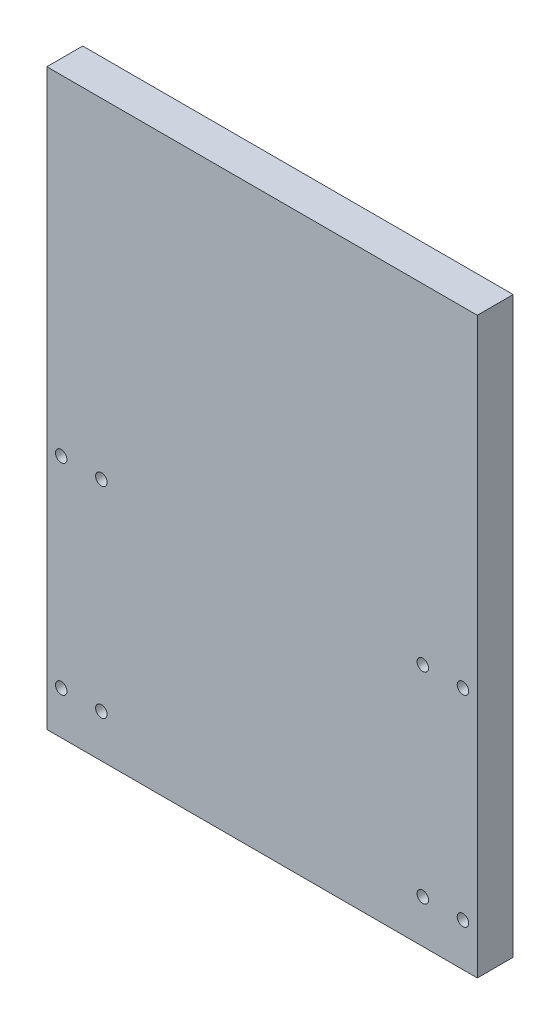
ISO-10303-21;
HEADER;
FILE_DESCRIPTION(('STEP AP214'),'2;1');
FILE_NAME('part.step','',(''),(''),'','','');
FILE_SCHEMA(('AUTOMOTIVE_DESIGN { 1 0 10303 214 1 1 1 1 }'));
ENDSEC;
DATA;
#1=APPLICATION_CONTEXT('core data for automotive mechanical design processes');
#2=APPLICATION_PROTOCOL_DEFINITION('international standard','automotive_design',2000,#1);
#3=PRODUCT_CONTEXT('',#1,'mechanical');
#4=PRODUCT('Part','Part','',(#3));
#5=PRODUCT_RELATED_PRODUCT_CATEGORY('part','',(#4));
#6=PRODUCT_DEFINITION_FORMATION('','',#4);
#7=PRODUCT_DEFINITION_CONTEXT('part definition',#1,'design');
#8=PRODUCT_DEFINITION('design','',#6,#7);
#9=PRODUCT_DEFINITION_SHAPE('','',#8);
#10=(LENGTH_UNIT() NAMED_UNIT(*) SI_UNIT(.MILLI.,.METRE.));
#11=(NAMED_UNIT(*) PLANE_ANGLE_UNIT() SI_UNIT($,.RADIAN.));
#12=(NAMED_UNIT(*) SI_UNIT($,.STERADIAN.) SOLID_ANGLE_UNIT());
#13=UNCERTAINTY_MEASURE_WITH_UNIT(LENGTH_MEASURE(1.E-05),#10,'distance_accuracy_value','');
#14=(GEOMETRIC_REPRESENTATION_CONTEXT(3) GLOBAL_UNCERTAINTY_ASSIGNED_CONTEXT((#13)) GLOBAL_UNIT_ASSIGNED_CONTEXT((#10,
#11,#12)) REPRESENTATION_CONTEXT('',''));
#15=CARTESIAN_POINT('',(0.,0.,0.));
#16=DIRECTION('',(0.,0.,1.));
#17=DIRECTION('',(1.,0.,0.));
#18=AXIS2_PLACEMENT_3D('',#15,#16,#17);
#19=CARTESIAN_POINT('',(150.,200.,-25.));
#20=DIRECTION('',(1.,0.,0.));
#21=DIRECTION('',(0.,1.,0.));
#22=AXIS2_PLACEMENT_3D('',#19,#20,#21);
#23=PLANE('',#22);
#24=DIRECTION('',(0.,1.,0.));
#25=VECTOR('',#24,1.);
#26=CARTESIAN_POINT('',(150.,200.,0.));
#27=LINE('',#26,#25);
#28=CARTESIAN_POINT('',(150.,-200.,0.));
#29=VERTEX_POINT('',#28);
#30=CARTESIAN_POINT('',(150.,200.,0.));
#31=VERTEX_POINT('',#30);
#32=EDGE_CURVE('E102',#29,#31,#27,.T.);
#33=ORIENTED_EDGE('',*,*,#32,.F.);
#34=DIRECTION('',(0.,0.,1.));
#35=VECTOR('',#34,1.);
#36=CARTESIAN_POINT('',(150.,-200.,-25.));
#37=LINE('',#36,#35);
#38=CARTESIAN_POINT('',(150.,-200.,-25.));
#39=VERTEX_POINT('',#38);
#40=EDGE_CURVE('E11',#39,#29,#37,.T.);
#41=ORIENTED_EDGE('',*,*,#40,.F.);
#42=DIRECTION('',(0.,1.,0.));
#43=VECTOR('',#42,1.);
#44=CARTESIAN_POINT('',(150.,200.,-25.));
#45=LINE('',#44,#43);
#46=CARTESIAN_POINT('',(150.,200.,-25.));
#47=VERTEX_POINT('',#46);
#48=EDGE_CURVE('E95',#39,#47,#45,.T.);
#49=ORIENTED_EDGE('',*,*,#48,.T.);
#50=DIRECTION('',(0.,0.,1.));
#51=VECTOR('',#50,1.);
#52=CARTESIAN_POINT('',(150.,200.,-25.));
#53=LINE('',#52,#51);
#54=EDGE_CURVE('E40',#47,#31,#53,.T.);
#55=ORIENTED_EDGE('',*,*,#54,.T.);
#56=EDGE_LOOP('',(#33,#41,#49,#55));
#57=FACE_BOUND('',#56,.T.);
#58=ADVANCED_FACE('F37',(#57),#23,.T.);
#59=CARTESIAN_POINT('',(-150.,-200.,-25.));
#60=DIRECTION('',(0.,-1.,0.));
#61=DIRECTION('',(0.,0.,-1.));
#62=AXIS2_PLACEMENT_3D('',#59,#60,#61);
#63=PLANE('',#62);
#64=DIRECTION('',(1.,0.,0.));
#65=VECTOR('',#64,1.);
#66=CARTESIAN_POINT('',(-150.,-200.,0.));
#67=LINE('',#66,#65);
#68=CARTESIAN_POINT('',(-150.,-200.,0.));
#69=VERTEX_POINT('',#68);
#70=EDGE_CURVE('E97',#69,#29,#67,.T.);
#71=ORIENTED_EDGE('',*,*,#70,.F.);
#72=DIRECTION('',(0.,0.,1.));
#73=VECTOR('',#72,1.);
#74=CARTESIAN_POINT('',(-150.,-200.,-25.));
#75=LINE('',#74,#73);
#76=CARTESIAN_POINT('',(-150.,-200.,-25.));
#77=VERTEX_POINT('',#76);
#78=EDGE_CURVE('E46',#77,#69,#75,.T.);
#79=ORIENTED_EDGE('',*,*,#78,.F.);
#80=DIRECTION('',(1.,0.,0.));
#81=VECTOR('',#80,1.);
#82=CARTESIAN_POINT('',(-150.,-200.,-25.));
#83=LINE('',#82,#81);
#84=EDGE_CURVE('E92',#77,#39,#83,.T.);
#85=ORIENTED_EDGE('',*,*,#84,.T.);
#86=ORIENTED_EDGE('',*,*,#40,.T.);
#87=EDGE_LOOP('',(#71,#79,#85,#86));
#88=FACE_BOUND('',#87,.T.);
#89=ADVANCED_FACE('F113',(#88),#63,.T.);
#90=CARTESIAN_POINT('',(-150.,200.,-25.));
#91=DIRECTION('',(-1.,0.,0.));
#92=DIRECTION('',(0.,-1.,0.));
#93=AXIS2_PLACEMENT_3D('',#90,#91,#92);
#94=PLANE('',#93);
#95=DIRECTION('',(0.,-1.,0.));
#96=VECTOR('',#95,1.);
#97=CARTESIAN_POINT('',(-150.,200.,0.));
#98=LINE('',#97,#96);
#99=CARTESIAN_POINT('',(-150.,200.,0.));
#100=VERTEX_POINT('',#99);
#101=EDGE_CURVE('E87',#100,#69,#98,.T.);
#102=ORIENTED_EDGE('',*,*,#101,.F.);
#103=DIRECTION('',(0.,0.,1.));
#104=VECTOR('',#103,1.);
#105=CARTESIAN_POINT('',(-150.,200.,-25.));
#106=LINE('',#105,#104);
#107=CARTESIAN_POINT('',(-150.,200.,-25.));
#108=VERTEX_POINT('',#107);
#109=EDGE_CURVE('E82',#108,#100,#106,.T.);
#110=ORIENTED_EDGE('',*,*,#109,.F.);
#111=DIRECTION('',(0.,-1.,0.));
#112=VECTOR('',#111,1.);
#113=CARTESIAN_POINT('',(-150.,200.,-25.));
#114=LINE('',#113,#112);
#115=EDGE_CURVE('E85',#108,#77,#114,.T.);
#116=ORIENTED_EDGE('',*,*,#115,.T.);
#117=ORIENTED_EDGE('',*,*,#78,.T.);
#118=EDGE_LOOP('',(#102,#110,#116,#117));
#119=FACE_BOUND('',#118,.T.);
#120=ADVANCED_FACE('F84',(#119),#94,.T.);
#121=CARTESIAN_POINT('',(-150.,200.,-25.));
#122=DIRECTION('',(0.,1.,0.));
#123=DIRECTION('',(0.,0.,1.));
#124=AXIS2_PLACEMENT_3D('',#121,#122,#123);
#125=PLANE('',#124);
#126=DIRECTION('',(-1.,0.,0.));
#127=VECTOR('',#126,1.);
#128=CARTESIAN_POINT('',(-150.,200.,0.));
#129=LINE('',#128,#127);
#130=EDGE_CURVE('E105',#31,#100,#129,.T.);
#131=ORIENTED_EDGE('',*,*,#130,.F.);
#132=ORIENTED_EDGE('',*,*,#54,.F.);
#133=DIRECTION('',(-1.,0.,0.));
#134=VECTOR('',#133,1.);
#135=CARTESIAN_POINT('',(-150.,200.,-25.));
#136=LINE('',#135,#134);
#137=EDGE_CURVE('E91',#47,#108,#136,.T.);
#138=ORIENTED_EDGE('',*,*,#137,.T.);
#139=ORIENTED_EDGE('',*,*,#109,.T.);
#140=EDGE_LOOP('',(#131,#132,#138,#139));
#141=FACE_BOUND('',#140,.T.);
#142=ADVANCED_FACE('F94',(#141),#125,.T.);
#143=CARTESIAN_POINT('',(0.,0.,-25.));
#144=DIRECTION('',(0.,0.,1.));
#145=DIRECTION('',(1.,0.,0.));
#146=AXIS2_PLACEMENT_3D('',#143,#144,#145);
#147=PLANE('',#146);
#148=CARTESIAN_POINT('',(-140.,-30.,-25.));
#149=DIRECTION('',(0.,0.,1.));
#150=DIRECTION('',(-1.,0.,0.));
#151=AXIS2_PLACEMENT_3D('',#148,#149,#150);
#152=CIRCLE('',#151,3.99999999999999);
#153=CARTESIAN_POINT('',(-144.,-30.,-25.));
#154=VERTEX_POINT('',#153);
#155=EDGE_CURVE('E170',#154,#154,#152,.T.);
#156=ORIENTED_EDGE('',*,*,#155,.T.);
#157=EDGE_LOOP('',(#156));
#158=FACE_BOUND('',#157,.T.);
#159=CARTESIAN_POINT('',(-112.,-30.,-25.));
#160=DIRECTION('',(0.,0.,1.));
#161=DIRECTION('',(-1.,0.,0.));
#162=AXIS2_PLACEMENT_3D('',#159,#160,#161);
#163=CIRCLE('',#162,4.00000000000001);
#164=CARTESIAN_POINT('',(-116.,-30.,-25.));
#165=VERTEX_POINT('',#164);
#166=EDGE_CURVE('E178',#165,#165,#163,.T.);
#167=ORIENTED_EDGE('',*,*,#166,.T.);
#168=EDGE_LOOP('',(#167));
#169=FACE_BOUND('',#168,.T.);
#170=CARTESIAN_POINT('',(140.,-30.,-25.));
#171=DIRECTION('',(0.,0.,1.));
#172=DIRECTION('',(1.,0.,0.));
#173=AXIS2_PLACEMENT_3D('',#170,#171,#172);
#174=CIRCLE('',#173,3.99999999999999);
#175=CARTESIAN_POINT('',(144.,-30.,-25.));
#176=VERTEX_POINT('',#175);
#177=EDGE_CURVE('E184',#176,#176,#174,.T.);
#178=ORIENTED_EDGE('',*,*,#177,.T.);
#179=EDGE_LOOP('',(#178));
#180=FACE_BOUND('',#179,.T.);
#181=CARTESIAN_POINT('',(112.,-30.0000000000001,-25.));
#182=DIRECTION('',(0.,0.,1.));
#183=DIRECTION('',(1.,0.,0.));
#184=AXIS2_PLACEMENT_3D('',#181,#182,#183);
#185=CIRCLE('',#184,4.00000000000001);
#186=CARTESIAN_POINT('',(116.,-30.0000000000001,-25.));
#187=VERTEX_POINT('',#186);
#188=EDGE_CURVE('E190',#187,#187,#185,.T.);
#189=ORIENTED_EDGE('',*,*,#188,.T.);
#190=EDGE_LOOP('',(#189));
#191=FACE_BOUND('',#190,.T.);
#192=CARTESIAN_POINT('',(140.,-170.,-25.));
#193=DIRECTION('',(0.,0.,1.));
#194=DIRECTION('',(-1.,0.,0.));
#195=AXIS2_PLACEMENT_3D('',#192,#193,#194);
#196=CIRCLE('',#195,3.99999999999999);
#197=CARTESIAN_POINT('',(136.,-170.,-25.));
#198=VERTEX_POINT('',#197);
#199=EDGE_CURVE('E196',#198,#198,#196,.T.);
#200=ORIENTED_EDGE('',*,*,#199,.T.);
#201=EDGE_LOOP('',(#200));
#202=FACE_BOUND('',#201,.T.);
#203=CARTESIAN_POINT('',(112.,-170.,-25.));
#204=DIRECTION('',(0.,0.,1.));
#205=DIRECTION('',(-1.,0.,0.));
#206=AXIS2_PLACEMENT_3D('',#203,#204,#205);
#207=CIRCLE('',#206,4.00000000000001);
#208=CARTESIAN_POINT('',(108.,-170.,-25.));
#209=VERTEX_POINT('',#208);
#210=EDGE_CURVE('E202',#209,#209,#207,.T.);
#211=ORIENTED_EDGE('',*,*,#210,.T.);
#212=EDGE_LOOP('',(#211));
#213=FACE_BOUND('',#212,.T.);
#214=CARTESIAN_POINT('',(-140.,-170.,-25.));
#215=DIRECTION('',(0.,0.,1.));
#216=DIRECTION('',(1.,0.,0.));
#217=AXIS2_PLACEMENT_3D('',#214,#215,#216);
#218=CIRCLE('',#217,3.99999999999999);
#219=CARTESIAN_POINT('',(-136.,-170.,-25.));
#220=VERTEX_POINT('',#219);
#221=EDGE_CURVE('E208',#220,#220,#218,.T.);
#222=ORIENTED_EDGE('',*,*,#221,.T.);
#223=EDGE_LOOP('',(#222));
#224=FACE_BOUND('',#223,.T.);
#225=CARTESIAN_POINT('',(-112.,-170.,-25.));
#226=DIRECTION('',(0.,0.,1.));
#227=DIRECTION('',(1.,0.,0.));
#228=AXIS2_PLACEMENT_3D('',#225,#226,#227);
#229=CIRCLE('',#228,4.00000000000001);
#230=CARTESIAN_POINT('',(-108.,-170.,-25.));
#231=VERTEX_POINT('',#230);
#232=EDGE_CURVE('E106',#231,#231,#229,.T.);
#233=ORIENTED_EDGE('',*,*,#232,.T.);
#234=EDGE_LOOP('',(#233));
#235=FACE_BOUND('',#234,.T.);
#236=ORIENTED_EDGE('',*,*,#48,.F.);
#237=ORIENTED_EDGE('',*,*,#84,.F.);
#238=ORIENTED_EDGE('',*,*,#115,.F.);
#239=ORIENTED_EDGE('',*,*,#137,.F.);
#240=EDGE_LOOP('',(#236,#237,#238,#239));
#241=FACE_BOUND('',#240,.T.);
#242=ADVANCED_FACE('F90',(#158,#169,#180,#191,#202,#213,#224,#235,#241),#147,.F.);
#243=CARTESIAN_POINT('',(0.,0.,0.));
#244=DIRECTION('',(0.,0.,1.));
#245=DIRECTION('',(1.,0.,0.));
#246=AXIS2_PLACEMENT_3D('',#243,#244,#245);
#247=PLANE('',#246);
#248=CARTESIAN_POINT('',(-140.,-30.,0.));
#249=DIRECTION('',(0.,0.,1.));
#250=DIRECTION('',(-1.,0.,0.));
#251=AXIS2_PLACEMENT_3D('',#248,#249,#250);
#252=CIRCLE('',#251,3.99999999999999);
#253=CARTESIAN_POINT('',(-144.,-30.,0.));
#254=VERTEX_POINT('',#253);
#255=EDGE_CURVE('E173',#254,#254,#252,.T.);
#256=ORIENTED_EDGE('',*,*,#255,.F.);
#257=EDGE_LOOP('',(#256));
#258=FACE_BOUND('',#257,.T.);
#259=CARTESIAN_POINT('',(-112.,-30.,0.));
#260=DIRECTION('',(0.,0.,1.));
#261=DIRECTION('',(-1.,0.,0.));
#262=AXIS2_PLACEMENT_3D('',#259,#260,#261);
#263=CIRCLE('',#262,4.00000000000001);
#264=CARTESIAN_POINT('',(-116.,-30.,0.));
#265=VERTEX_POINT('',#264);
#266=EDGE_CURVE('E175',#265,#265,#263,.T.);
#267=ORIENTED_EDGE('',*,*,#266,.F.);
#268=EDGE_LOOP('',(#267));
#269=FACE_BOUND('',#268,.T.);
#270=CARTESIAN_POINT('',(140.,-30.,0.));
#271=DIRECTION('',(0.,0.,1.));
#272=DIRECTION('',(1.,0.,0.));
#273=AXIS2_PLACEMENT_3D('',#270,#271,#272);
#274=CIRCLE('',#273,3.99999999999999);
#275=CARTESIAN_POINT('',(144.,-30.,0.));
#276=VERTEX_POINT('',#275);
#277=EDGE_CURVE('E181',#276,#276,#274,.T.);
#278=ORIENTED_EDGE('',*,*,#277,.F.);
#279=EDGE_LOOP('',(#278));
#280=FACE_BOUND('',#279,.T.);
#281=CARTESIAN_POINT('',(112.,-30.0000000000001,0.));
#282=DIRECTION('',(0.,0.,1.));
#283=DIRECTION('',(1.,0.,0.));
#284=AXIS2_PLACEMENT_3D('',#281,#282,#283);
#285=CIRCLE('',#284,4.00000000000001);
#286=CARTESIAN_POINT('',(116.,-30.0000000000001,0.));
#287=VERTEX_POINT('',#286);
#288=EDGE_CURVE('E187',#287,#287,#285,.T.);
#289=ORIENTED_EDGE('',*,*,#288,.F.);
#290=EDGE_LOOP('',(#289));
#291=FACE_BOUND('',#290,.T.);
#292=CARTESIAN_POINT('',(140.,-170.,0.));
#293=DIRECTION('',(0.,0.,1.));
#294=DIRECTION('',(-1.,0.,0.));
#295=AXIS2_PLACEMENT_3D('',#292,#293,#294);
#296=CIRCLE('',#295,3.99999999999999);
#297=CARTESIAN_POINT('',(136.,-170.,0.));
#298=VERTEX_POINT('',#297);
#299=EDGE_CURVE('E193',#298,#298,#296,.T.);
#300=ORIENTED_EDGE('',*,*,#299,.F.);
#301=EDGE_LOOP('',(#300));
#302=FACE_BOUND('',#301,.T.);
#303=CARTESIAN_POINT('',(112.,-170.,0.));
#304=DIRECTION('',(0.,0.,1.));
#305=DIRECTION('',(-1.,0.,0.));
#306=AXIS2_PLACEMENT_3D('',#303,#304,#305);
#307=CIRCLE('',#306,4.00000000000001);
#308=CARTESIAN_POINT('',(108.,-170.,0.));
#309=VERTEX_POINT('',#308);
#310=EDGE_CURVE('E199',#309,#309,#307,.T.);
#311=ORIENTED_EDGE('',*,*,#310,.F.);
#312=EDGE_LOOP('',(#311));
#313=FACE_BOUND('',#312,.T.);
#314=CARTESIAN_POINT('',(-140.,-170.,0.));
#315=DIRECTION('',(0.,0.,1.));
#316=DIRECTION('',(1.,0.,0.));
#317=AXIS2_PLACEMENT_3D('',#314,#315,#316);
#318=CIRCLE('',#317,3.99999999999999);
#319=CARTESIAN_POINT('',(-136.,-170.,0.));
#320=VERTEX_POINT('',#319);
#321=EDGE_CURVE('E205',#320,#320,#318,.T.);
#322=ORIENTED_EDGE('',*,*,#321,.F.);
#323=EDGE_LOOP('',(#322));
#324=FACE_BOUND('',#323,.T.);
#325=CARTESIAN_POINT('',(-112.,-170.,0.));
#326=DIRECTION('',(0.,0.,1.));
#327=DIRECTION('',(1.,0.,0.));
#328=AXIS2_PLACEMENT_3D('',#325,#326,#327);
#329=CIRCLE('',#328,4.00000000000001);
#330=CARTESIAN_POINT('',(-108.,-170.,0.));
#331=VERTEX_POINT('',#330);
#332=EDGE_CURVE('E211',#331,#331,#329,.T.);
#333=ORIENTED_EDGE('',*,*,#332,.F.);
#334=EDGE_LOOP('',(#333));
#335=FACE_BOUND('',#334,.T.);
#336=ORIENTED_EDGE('',*,*,#32,.T.);
#337=ORIENTED_EDGE('',*,*,#130,.T.);
#338=ORIENTED_EDGE('',*,*,#101,.T.);
#339=ORIENTED_EDGE('',*,*,#70,.T.);
#340=EDGE_LOOP('',(#336,#337,#338,#339));
#341=FACE_BOUND('',#340,.T.);
#342=ADVANCED_FACE('F112',(#258,#269,#280,#291,#302,#313,#324,#335,#341),#247,.T.);
#343=CARTESIAN_POINT('',(-112.,-170.,-25.));
#344=DIRECTION('',(0.,0.,1.));
#345=DIRECTION('',(1.,0.,0.));
#346=AXIS2_PLACEMENT_3D('',#343,#344,#345);
#347=CYLINDRICAL_SURFACE('',#346,4.00000000000001);
#348=ORIENTED_EDGE('',*,*,#232,.F.);
#349=EDGE_LOOP('',(#348));
#350=FACE_BOUND('',#349,.T.);
#351=ORIENTED_EDGE('',*,*,#332,.T.);
#352=EDGE_LOOP('',(#351));
#353=FACE_BOUND('',#352,.T.);
#354=ADVANCED_FACE('F131',(#350,#353),#347,.F.);
#355=CARTESIAN_POINT('',(-140.,-170.,-25.));
#356=DIRECTION('',(0.,0.,1.));
#357=DIRECTION('',(1.,0.,0.));
#358=AXIS2_PLACEMENT_3D('',#355,#356,#357);
#359=CYLINDRICAL_SURFACE('',#358,3.99999999999999);
#360=ORIENTED_EDGE('',*,*,#221,.F.);
#361=EDGE_LOOP('',(#360));
#362=FACE_BOUND('',#361,.T.);
#363=ORIENTED_EDGE('',*,*,#321,.T.);
#364=EDGE_LOOP('',(#363));
#365=FACE_BOUND('',#364,.T.);
#366=ADVANCED_FACE('F138',(#362,#365),#359,.F.);
#367=CARTESIAN_POINT('',(112.,-170.,-25.));
#368=DIRECTION('',(0.,0.,1.));
#369=DIRECTION('',(1.,0.,0.));
#370=AXIS2_PLACEMENT_3D('',#367,#368,#369);
#371=CYLINDRICAL_SURFACE('',#370,4.00000000000001);
#372=ORIENTED_EDGE('',*,*,#210,.F.);
#373=EDGE_LOOP('',(#372));
#374=FACE_BOUND('',#373,.T.);
#375=ORIENTED_EDGE('',*,*,#310,.T.);
#376=EDGE_LOOP('',(#375));
#377=FACE_BOUND('',#376,.T.);
#378=ADVANCED_FACE('F142',(#374,#377),#371,.F.);
#379=CARTESIAN_POINT('',(140.,-170.,-25.));
#380=DIRECTION('',(0.,0.,1.));
#381=DIRECTION('',(1.,0.,0.));
#382=AXIS2_PLACEMENT_3D('',#379,#380,#381);
#383=CYLINDRICAL_SURFACE('',#382,3.99999999999999);
#384=ORIENTED_EDGE('',*,*,#199,.F.);
#385=EDGE_LOOP('',(#384));
#386=FACE_BOUND('',#385,.T.);
#387=ORIENTED_EDGE('',*,*,#299,.T.);
#388=EDGE_LOOP('',(#387));
#389=FACE_BOUND('',#388,.T.);
#390=ADVANCED_FACE('F146',(#386,#389),#383,.F.);
#391=CARTESIAN_POINT('',(112.,-30.0000000000001,-25.));
#392=DIRECTION('',(0.,0.,1.));
#393=DIRECTION('',(1.,0.,0.));
#394=AXIS2_PLACEMENT_3D('',#391,#392,#393);
#395=CYLINDRICAL_SURFACE('',#394,4.00000000000001);
#396=ORIENTED_EDGE('',*,*,#188,.F.);
#397=EDGE_LOOP('',(#396));
#398=FACE_BOUND('',#397,.T.);
#399=ORIENTED_EDGE('',*,*,#288,.T.);
#400=EDGE_LOOP('',(#399));
#401=FACE_BOUND('',#400,.T.);
#402=ADVANCED_FACE('F150',(#398,#401),#395,.F.);
#403=CARTESIAN_POINT('',(140.,-30.,-25.));
#404=DIRECTION('',(0.,0.,1.));
#405=DIRECTION('',(1.,0.,0.));
#406=AXIS2_PLACEMENT_3D('',#403,#404,#405);
#407=CYLINDRICAL_SURFACE('',#406,3.99999999999999);
#408=ORIENTED_EDGE('',*,*,#177,.F.);
#409=EDGE_LOOP('',(#408));
#410=FACE_BOUND('',#409,.T.);
#411=ORIENTED_EDGE('',*,*,#277,.T.);
#412=EDGE_LOOP('',(#411));
#413=FACE_BOUND('',#412,.T.);
#414=ADVANCED_FACE('F154',(#410,#413),#407,.F.);
#415=CARTESIAN_POINT('',(-112.,-30.,-25.));
#416=DIRECTION('',(0.,0.,1.));
#417=DIRECTION('',(1.,0.,0.));
#418=AXIS2_PLACEMENT_3D('',#415,#416,#417);
#419=CYLINDRICAL_SURFACE('',#418,4.00000000000001);
#420=ORIENTED_EDGE('',*,*,#166,.F.);
#421=EDGE_LOOP('',(#420));
#422=FACE_BOUND('',#421,.T.);
#423=ORIENTED_EDGE('',*,*,#266,.T.);
#424=EDGE_LOOP('',(#423));
#425=FACE_BOUND('',#424,.T.);
#426=ADVANCED_FACE('F158',(#422,#425),#419,.F.);
#427=CARTESIAN_POINT('',(-140.,-30.,-25.));
#428=DIRECTION('',(0.,0.,1.));
#429=DIRECTION('',(1.,0.,0.));
#430=AXIS2_PLACEMENT_3D('',#427,#428,#429);
#431=CYLINDRICAL_SURFACE('',#430,3.99999999999999);
#432=ORIENTED_EDGE('',*,*,#155,.F.);
#433=EDGE_LOOP('',(#432));
#434=FACE_BOUND('',#433,.T.);
#435=ORIENTED_EDGE('',*,*,#255,.T.);
#436=EDGE_LOOP('',(#435));
#437=FACE_BOUND('',#436,.T.);
#438=ADVANCED_FACE('F162',(#434,#437),#431,.F.);
#439=CLOSED_SHELL('',(#58,#89,#120,#142,#242,#342,#354,#366,#378,#390,#402,#414,#426,#438));
#440=MANIFOLD_SOLID_BREP('B2',#439);
#441=ADVANCED_BREP_SHAPE_REPRESENTATION('',(#18,#440),#14);
#442=SHAPE_DEFINITION_REPRESENTATION(#9,#441);
ENDSEC;
END-ISO-10303-21;
